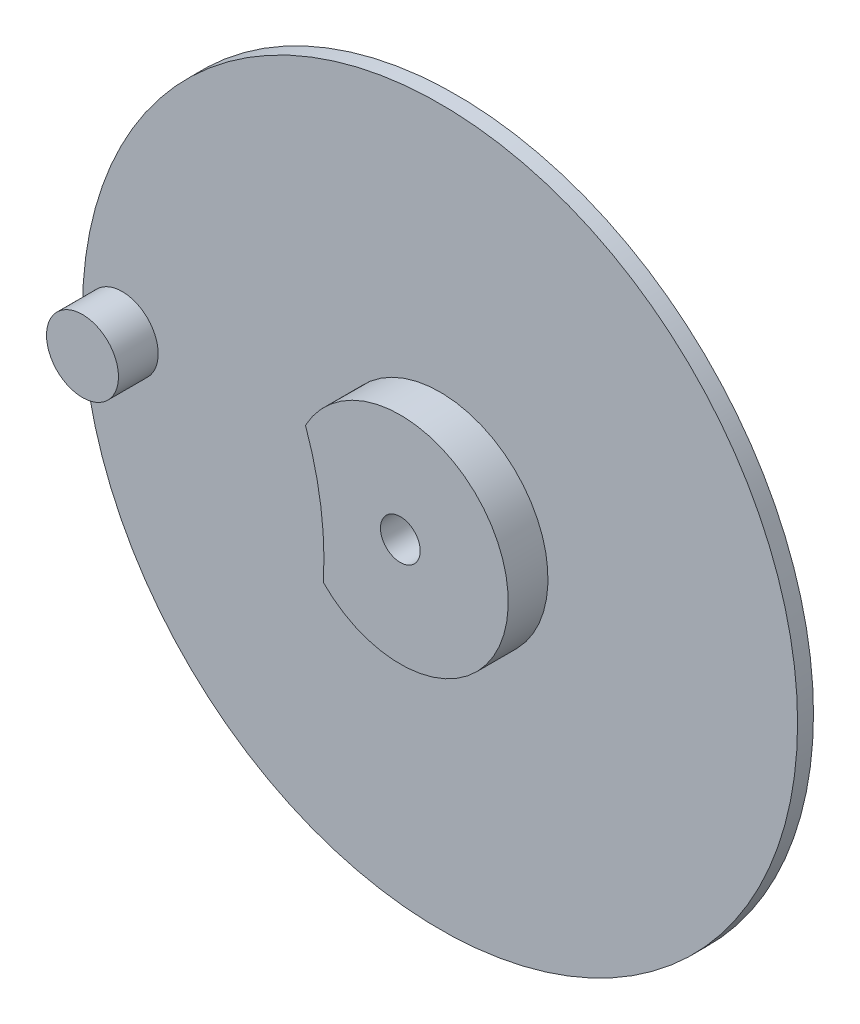
ISO-10303-21;
HEADER;
FILE_DESCRIPTION(('STEP AP214'),'2;1');
FILE_NAME('part.step','',(''),(''),'','','');
FILE_SCHEMA(('AUTOMOTIVE_DESIGN { 1 0 10303 214 1 1 1 1 }'));
ENDSEC;
DATA;
#1=APPLICATION_CONTEXT('core data for automotive mechanical design processes');
#2=APPLICATION_PROTOCOL_DEFINITION('international standard','automotive_design',2000,#1);
#3=PRODUCT_CONTEXT('',#1,'mechanical');
#4=PRODUCT('Part','Part','',(#3));
#5=PRODUCT_RELATED_PRODUCT_CATEGORY('part','',(#4));
#6=PRODUCT_DEFINITION_FORMATION('','',#4);
#7=PRODUCT_DEFINITION_CONTEXT('part definition',#1,'design');
#8=PRODUCT_DEFINITION('design','',#6,#7);
#9=PRODUCT_DEFINITION_SHAPE('','',#8);
#10=(LENGTH_UNIT() NAMED_UNIT(*) SI_UNIT(.MILLI.,.METRE.));
#11=(NAMED_UNIT(*) PLANE_ANGLE_UNIT() SI_UNIT($,.RADIAN.));
#12=(NAMED_UNIT(*) SI_UNIT($,.STERADIAN.) SOLID_ANGLE_UNIT());
#13=UNCERTAINTY_MEASURE_WITH_UNIT(LENGTH_MEASURE(1.E-05),#10,'distance_accuracy_value','');
#14=(GEOMETRIC_REPRESENTATION_CONTEXT(3) GLOBAL_UNCERTAINTY_ASSIGNED_CONTEXT((#13)) GLOBAL_UNIT_ASSIGNED_CONTEXT((#10,
#11,#12)) REPRESENTATION_CONTEXT('',''));
#15=CARTESIAN_POINT('',(0.,0.,0.));
#16=DIRECTION('',(0.,0.,1.));
#17=DIRECTION('',(1.,0.,0.));
#18=AXIS2_PLACEMENT_3D('',#15,#16,#17);
#19=CARTESIAN_POINT('',(1.30433178975156,-0.0378566474408444,-3.3207059005087));
#20=DIRECTION('',(0.,0.,1.));
#21=DIRECTION('',(1.,0.,0.));
#22=AXIS2_PLACEMENT_3D('',#19,#20,#21);
#23=CYLINDRICAL_SURFACE('',#22,4.96875);
#24=CARTESIAN_POINT('',(1.30433178975156,-0.0378566474408444,-3.3207059005087));
#25=DIRECTION('',(0.,0.,1.));
#26=DIRECTION('',(1.,0.,0.));
#27=AXIS2_PLACEMENT_3D('',#24,#25,#26);
#28=CIRCLE('',#27,4.96875);
#29=CARTESIAN_POINT('',(6.27308178975156,-0.0378566474408444,-3.3207059005087));
#30=VERTEX_POINT('',#29);
#31=EDGE_CURVE('E54',#30,#30,#28,.T.);
#32=CARTESIAN_POINT('',(1.30433178975156,-0.0378566474408444,10.5917940994913));
#33=DIRECTION('',(0.,0.,1.));
#34=DIRECTION('',(1.,0.,0.));
#35=AXIS2_PLACEMENT_3D('',#32,#33,#34);
#36=CIRCLE('',#35,4.96875);
#37=CARTESIAN_POINT('',(6.27308178975156,-0.0378566474408444,10.5917940994913));
#38=VERTEX_POINT('',#37);
#39=EDGE_CURVE('E81',#38,#38,#36,.T.);
#40=CARTESIAN_POINT('',(6.27308178975156,-0.0378566474408444,-3.3207059005087));
#41=CARTESIAN_POINT('',(6.27308178975156,-0.0378566474408444,-3.1757840255087));
#42=CARTESIAN_POINT('',(6.27308178975156,-0.0378566474408444,-3.0308621505087));
#43=CARTESIAN_POINT('',(6.27308178975156,-0.0378566474408444,-2.7410184005087));
#44=CARTESIAN_POINT('',(6.27308178975156,-0.0378566474408444,-2.5960965255087));
#45=CARTESIAN_POINT('',(6.27308178975156,-0.0378566474408444,-2.3062527755087));
#46=CARTESIAN_POINT('',(6.27308178975156,-0.0378566474408444,-2.1613309005087));
#47=CARTESIAN_POINT('',(6.27308178975156,-0.0378566474408444,-1.8714871505087));
#48=CARTESIAN_POINT('',(6.27308178975156,-0.0378566474408444,-1.7265652755087));
#49=CARTESIAN_POINT('',(6.27308178975156,-0.0378566474408444,-1.4367215255087));
#50=CARTESIAN_POINT('',(6.27308178975156,-0.0378566474408444,-1.2917996505087));
#51=CARTESIAN_POINT('',(6.27308178975156,-0.0378566474408444,-1.0019559005087));
#52=CARTESIAN_POINT('',(6.27308178975156,-0.0378566474408444,-0.857034025508697));
#53=CARTESIAN_POINT('',(6.27308178975156,-0.0378566474408444,-0.567190275508697));
#54=CARTESIAN_POINT('',(6.27308178975156,-0.0378566474408444,-0.422268400508697));
#55=CARTESIAN_POINT('',(6.27308178975156,-0.0378566474408444,-0.132424650508697));
#56=CARTESIAN_POINT('',(6.27308178975156,-0.0378566474408444,0.0124972244913031));
#57=CARTESIAN_POINT('',(6.27308178975156,-0.0378566474408444,0.302340974491303));
#58=CARTESIAN_POINT('',(6.27308178975156,-0.0378566474408444,0.447262849491303));
#59=CARTESIAN_POINT('',(6.27308178975156,-0.0378566474408444,0.737106599491303));
#60=CARTESIAN_POINT('',(6.27308178975156,-0.0378566474408444,0.882028474491303));
#61=CARTESIAN_POINT('',(6.27308178975156,-0.0378566474408444,1.1718722244913));
#62=CARTESIAN_POINT('',(6.27308178975156,-0.0378566474408444,1.3167940994913));
#63=CARTESIAN_POINT('',(6.27308178975156,-0.0378566474408444,1.6066378494913));
#64=CARTESIAN_POINT('',(6.27308178975156,-0.0378566474408444,1.7515597244913));
#65=CARTESIAN_POINT('',(6.27308178975156,-0.0378566474408444,2.0414034744913));
#66=CARTESIAN_POINT('',(6.27308178975156,-0.0378566474408444,2.1863253494913));
#67=CARTESIAN_POINT('',(6.27308178975156,-0.0378566474408444,2.4761690994913));
#68=CARTESIAN_POINT('',(6.27308178975156,-0.0378566474408444,2.6210909744913));
#69=CARTESIAN_POINT('',(6.27308178975156,-0.0378566474408444,2.9109347244913));
#70=CARTESIAN_POINT('',(6.27308178975156,-0.0378566474408444,3.0558565994913));
#71=CARTESIAN_POINT('',(6.27308178975156,-0.0378566474408444,3.3457003494913));
#72=CARTESIAN_POINT('',(6.27308178975156,-0.0378566474408444,3.4906222244913));
#73=CARTESIAN_POINT('',(6.27308178975156,-0.0378566474408444,3.7804659744913));
#74=CARTESIAN_POINT('',(6.27308178975156,-0.0378566474408444,3.9253878494913));
#75=CARTESIAN_POINT('',(6.27308178975156,-0.0378566474408444,4.2152315994913));
#76=CARTESIAN_POINT('',(6.27308178975156,-0.0378566474408444,4.3601534744913));
#77=CARTESIAN_POINT('',(6.27308178975156,-0.0378566474408444,4.6499972244913));
#78=CARTESIAN_POINT('',(6.27308178975156,-0.0378566474408444,4.7949190994913));
#79=CARTESIAN_POINT('',(6.27308178975156,-0.0378566474408444,5.0847628494913));
#80=CARTESIAN_POINT('',(6.27308178975156,-0.0378566474408444,5.2296847244913));
#81=CARTESIAN_POINT('',(6.27308178975156,-0.0378566474408444,5.5195284744913));
#82=CARTESIAN_POINT('',(6.27308178975156,-0.0378566474408444,5.6644503494913));
#83=CARTESIAN_POINT('',(6.27308178975156,-0.0378566474408444,5.9542940994913));
#84=CARTESIAN_POINT('',(6.27308178975156,-0.0378566474408444,6.0992159744913));
#85=CARTESIAN_POINT('',(6.27308178975156,-0.0378566474408444,6.3890597244913));
#86=CARTESIAN_POINT('',(6.27308178975156,-0.0378566474408444,6.5339815994913));
#87=CARTESIAN_POINT('',(6.27308178975156,-0.0378566474408444,6.8238253494913));
#88=CARTESIAN_POINT('',(6.27308178975156,-0.0378566474408444,6.9687472244913));
#89=CARTESIAN_POINT('',(6.27308178975156,-0.0378566474408444,7.2585909744913));
#90=CARTESIAN_POINT('',(6.27308178975156,-0.0378566474408444,7.4035128494913));
#91=CARTESIAN_POINT('',(6.27308178975156,-0.0378566474408444,7.6933565994913));
#92=CARTESIAN_POINT('',(6.27308178975156,-0.0378566474408444,7.8382784744913));
#93=CARTESIAN_POINT('',(6.27308178975156,-0.0378566474408444,8.1281222244913));
#94=CARTESIAN_POINT('',(6.27308178975156,-0.0378566474408444,8.2730440994913));
#95=CARTESIAN_POINT('',(6.27308178975156,-0.0378566474408444,8.5628878494913));
#96=CARTESIAN_POINT('',(6.27308178975156,-0.0378566474408444,8.7078097244913));
#97=CARTESIAN_POINT('',(6.27308178975156,-0.0378566474408444,8.9976534744913));
#98=CARTESIAN_POINT('',(6.27308178975156,-0.0378566474408444,9.1425753494913));
#99=CARTESIAN_POINT('',(6.27308178975156,-0.0378566474408444,9.4324190994913));
#100=CARTESIAN_POINT('',(6.27308178975156,-0.0378566474408444,9.5773409744913));
#101=CARTESIAN_POINT('',(6.27308178975156,-0.0378566474408444,9.8671847244913));
#102=CARTESIAN_POINT('',(6.27308178975156,-0.0378566474408444,10.0121065994913));
#103=CARTESIAN_POINT('',(6.27308178975156,-0.0378566474408444,10.3019503494913));
#104=CARTESIAN_POINT('',(6.27308178975156,-0.0378566474408444,10.4468722244913));
#105=CARTESIAN_POINT('',(6.27308178975156,-0.0378566474408444,10.5917940994913));
#106=B_SPLINE_CURVE_WITH_KNOTS('',3,(#40,#41,#42,#43,#44,#45,#46,#47,#48,#49,#50,#51,#52,#53,
#54,#55,#56,#57,#58,#59,#60,#61,#62,#63,#64,#65,#66,#67,#68,#69,#70,#71,#72,#73,#74,#75,#76,#77,
#78,#79,#80,#81,#82,#83,#84,#85,#86,#87,#88,#89,#90,#91,#92,#93,#94,#95,#96,#97,#98,#99,#100,
#101,#102,#103,#104,#105),.UNSPECIFIED.,.F.,.F.,(4,2,2,2,2,2,2,2,2,2,2,2,2,2,2,2,2,2,2,2,2,2,2,
2,2,2,2,2,2,2,2,2,4),(0.,0.434765625,0.86953125,1.304296875,1.7390625,2.173828125,2.60859375,
3.043359375,3.478125,3.912890625,4.34765625,4.782421875,5.2171875,5.651953125,6.08671875,
6.521484375,6.95625,7.391015625,7.82578125,8.260546875,8.6953125,9.130078125,9.56484375,
9.999609375,10.434375,10.869140625,11.30390625,11.738671875,12.1734375,12.608203125,13.04296875,
13.477734375,13.9125),.UNSPECIFIED.);
#107=EDGE_CURVE('BSEAM45',#30,#38,#106,.T.);
#108=ORIENTED_EDGE('',*,*,#31,.F.);
#109=ORIENTED_EDGE('',*,*,#39,.T.);
#110=ORIENTED_EDGE('',*,*,#107,.T.);
#111=ORIENTED_EDGE('',*,*,#107,.F.);
#112=EDGE_LOOP('',(#108,#110,#109,#111));
#113=FACE_BOUND('',#112,.T.);
#114=ADVANCED_FACE('F45',(#113),#23,.F.);
#115=CARTESIAN_POINT('',(1.30433178975156,-0.0378566474408444,-3.3207059005087));
#116=DIRECTION('',(0.,0.,1.));
#117=DIRECTION('',(1.,0.,0.));
#118=AXIS2_PLACEMENT_3D('',#115,#116,#117);
#119=CYLINDRICAL_SURFACE('',#118,89.4375);
#120=CARTESIAN_POINT('',(1.30433178975156,-0.0378566474408444,-3.3207059005087));
#121=DIRECTION('',(0.,0.,1.));
#122=DIRECTION('',(1.,0.,0.));
#123=AXIS2_PLACEMENT_3D('',#120,#121,#122);
#124=CIRCLE('',#123,89.4375);
#125=CARTESIAN_POINT('',(90.7418317897516,-0.0378566474408444,-3.3207059005087));
#126=VERTEX_POINT('',#125);
#127=EDGE_CURVE('E11',#126,#126,#124,.T.);
#128=CARTESIAN_POINT('',(1.30433178975156,-0.0378566474408444,0.654294099491304));
#129=DIRECTION('',(0.,0.,1.));
#130=DIRECTION('',(1.,0.,0.));
#131=AXIS2_PLACEMENT_3D('',#128,#129,#130);
#132=CIRCLE('',#131,89.4375);
#133=CARTESIAN_POINT('',(90.7418317897516,-0.0378566474408444,0.654294099491304));
#134=VERTEX_POINT('',#133);
#135=EDGE_CURVE('E48',#134,#134,#132,.T.);
#136=CARTESIAN_POINT('',(90.7418317897516,-0.0378566474408444,-3.3207059005087));
#137=CARTESIAN_POINT('',(90.7418317897516,-0.0378566474408444,-3.2792996505087));
#138=CARTESIAN_POINT('',(90.7418317897516,-0.0378566474408444,-3.2378934005087));
#139=CARTESIAN_POINT('',(90.7418317897516,-0.0378566474408444,-3.1550809005087));
#140=CARTESIAN_POINT('',(90.7418317897516,-0.0378566474408444,-3.1136746505087));
#141=CARTESIAN_POINT('',(90.7418317897516,-0.0378566474408444,-3.0308621505087));
#142=CARTESIAN_POINT('',(90.7418317897516,-0.0378566474408444,-2.9894559005087));
#143=CARTESIAN_POINT('',(90.7418317897516,-0.0378566474408444,-2.9066434005087));
#144=CARTESIAN_POINT('',(90.7418317897516,-0.0378566474408444,-2.8652371505087));
#145=CARTESIAN_POINT('',(90.7418317897516,-0.0378566474408444,-2.7824246505087));
#146=CARTESIAN_POINT('',(90.7418317897516,-0.0378566474408444,-2.7410184005087));
#147=CARTESIAN_POINT('',(90.7418317897516,-0.0378566474408444,-2.6582059005087));
#148=CARTESIAN_POINT('',(90.7418317897516,-0.0378566474408444,-2.6167996505087));
#149=CARTESIAN_POINT('',(90.7418317897516,-0.0378566474408444,-2.5339871505087));
#150=CARTESIAN_POINT('',(90.7418317897516,-0.0378566474408444,-2.4925809005087));
#151=CARTESIAN_POINT('',(90.7418317897516,-0.0378566474408444,-2.4097684005087));
#152=CARTESIAN_POINT('',(90.7418317897516,-0.0378566474408444,-2.3683621505087));
#153=CARTESIAN_POINT('',(90.7418317897516,-0.0378566474408444,-2.2855496505087));
#154=CARTESIAN_POINT('',(90.7418317897516,-0.0378566474408444,-2.2441434005087));
#155=CARTESIAN_POINT('',(90.7418317897516,-0.0378566474408444,-2.1613309005087));
#156=CARTESIAN_POINT('',(90.7418317897516,-0.0378566474408444,-2.1199246505087));
#157=CARTESIAN_POINT('',(90.7418317897516,-0.0378566474408444,-2.0371121505087));
#158=CARTESIAN_POINT('',(90.7418317897516,-0.0378566474408444,-1.9957059005087));
#159=CARTESIAN_POINT('',(90.7418317897516,-0.0378566474408444,-1.9128934005087));
#160=CARTESIAN_POINT('',(90.7418317897516,-0.0378566474408444,-1.8714871505087));
#161=CARTESIAN_POINT('',(90.7418317897516,-0.0378566474408444,-1.7886746505087));
#162=CARTESIAN_POINT('',(90.7418317897516,-0.0378566474408444,-1.7472684005087));
#163=CARTESIAN_POINT('',(90.7418317897516,-0.0378566474408444,-1.6644559005087));
#164=CARTESIAN_POINT('',(90.7418317897516,-0.0378566474408444,-1.6230496505087));
#165=CARTESIAN_POINT('',(90.7418317897516,-0.0378566474408444,-1.5402371505087));
#166=CARTESIAN_POINT('',(90.7418317897516,-0.0378566474408444,-1.4988309005087));
#167=CARTESIAN_POINT('',(90.7418317897516,-0.0378566474408444,-1.4160184005087));
#168=CARTESIAN_POINT('',(90.7418317897516,-0.0378566474408444,-1.3746121505087));
#169=CARTESIAN_POINT('',(90.7418317897516,-0.0378566474408444,-1.2917996505087));
#170=CARTESIAN_POINT('',(90.7418317897516,-0.0378566474408444,-1.2503934005087));
#171=CARTESIAN_POINT('',(90.7418317897516,-0.0378566474408444,-1.1675809005087));
#172=CARTESIAN_POINT('',(90.7418317897516,-0.0378566474408444,-1.1261746505087));
#173=CARTESIAN_POINT('',(90.7418317897516,-0.0378566474408444,-1.0433621505087));
#174=CARTESIAN_POINT('',(90.7418317897516,-0.0378566474408444,-1.0019559005087));
#175=CARTESIAN_POINT('',(90.7418317897516,-0.0378566474408444,-0.919143400508697));
#176=CARTESIAN_POINT('',(90.7418317897516,-0.0378566474408444,-0.877737150508697));
#177=CARTESIAN_POINT('',(90.7418317897516,-0.0378566474408444,-0.794924650508697));
#178=CARTESIAN_POINT('',(90.7418317897516,-0.0378566474408444,-0.753518400508697));
#179=CARTESIAN_POINT('',(90.7418317897516,-0.0378566474408444,-0.670705900508696));
#180=CARTESIAN_POINT('',(90.7418317897516,-0.0378566474408444,-0.629299650508697));
#181=CARTESIAN_POINT('',(90.7418317897516,-0.0378566474408444,-0.546487150508697));
#182=CARTESIAN_POINT('',(90.7418317897516,-0.0378566474408444,-0.505080900508697));
#183=CARTESIAN_POINT('',(90.7418317897516,-0.0378566474408444,-0.422268400508697));
#184=CARTESIAN_POINT('',(90.7418317897516,-0.0378566474408444,-0.380862150508697));
#185=CARTESIAN_POINT('',(90.7418317897516,-0.0378566474408444,-0.298049650508696));
#186=CARTESIAN_POINT('',(90.7418317897516,-0.0378566474408444,-0.256643400508696));
#187=CARTESIAN_POINT('',(90.7418317897516,-0.0378566474408444,-0.173830900508696));
#188=CARTESIAN_POINT('',(90.7418317897516,-0.0378566474408444,-0.132424650508696));
#189=CARTESIAN_POINT('',(90.7418317897516,-0.0378566474408444,-0.0496121505086965));
#190=CARTESIAN_POINT('',(90.7418317897516,-0.0378566474408444,-0.0082059005086964));
#191=CARTESIAN_POINT('',(90.7418317897516,-0.0378566474408444,0.0746065994913037));
#192=CARTESIAN_POINT('',(90.7418317897516,-0.0378566474408444,0.116012849491304));
#193=CARTESIAN_POINT('',(90.7418317897516,-0.0378566474408444,0.198825349491304));
#194=CARTESIAN_POINT('',(90.7418317897516,-0.0378566474408444,0.240231599491304));
#195=CARTESIAN_POINT('',(90.7418317897516,-0.0378566474408444,0.323044099491304));
#196=CARTESIAN_POINT('',(90.7418317897516,-0.0378566474408444,0.364450349491304));
#197=CARTESIAN_POINT('',(90.7418317897516,-0.0378566474408444,0.447262849491304));
#198=CARTESIAN_POINT('',(90.7418317897516,-0.0378566474408444,0.488669099491304));
#199=CARTESIAN_POINT('',(90.7418317897516,-0.0378566474408444,0.571481599491304));
#200=CARTESIAN_POINT('',(90.7418317897516,-0.0378566474408444,0.612887849491304));
#201=CARTESIAN_POINT('',(90.7418317897516,-0.0378566474408444,0.654294099491304));
#202=B_SPLINE_CURVE_WITH_KNOTS('',3,(#136,#137,#138,#139,#140,#141,#142,#143,#144,#145,#146,
#147,#148,#149,#150,#151,#152,#153,#154,#155,#156,#157,#158,#159,#160,#161,#162,#163,#164,#165,
#166,#167,#168,#169,#170,#171,#172,#173,#174,#175,#176,#177,#178,#179,#180,#181,#182,#183,#184,
#185,#186,#187,#188,#189,#190,#191,#192,#193,#194,#195,#196,#197,#198,#199,#200,#201),
.UNSPECIFIED.,.F.,.F.,(4,2,2,2,2,2,2,2,2,2,2,2,2,2,2,2,2,2,2,2,2,2,2,2,2,2,2,2,2,2,2,2,4),(0.,
0.12421875,0.2484375,0.37265625,0.496875,0.62109375,0.7453125,0.869531250000001,0.99375,
1.11796875,1.2421875,1.36640625,1.490625,1.61484375,1.7390625,1.86328125,1.9875,2.11171875,
2.2359375,2.36015625,2.484375,2.60859375,2.7328125,2.85703125,2.98125,3.10546875,3.2296875,
3.35390625,3.478125,3.60234375,3.7265625,3.85078125,3.975),.UNSPECIFIED.);
#203=EDGE_CURVE('BSEAM111',#126,#134,#202,.T.);
#204=ORIENTED_EDGE('',*,*,#127,.T.);
#205=ORIENTED_EDGE('',*,*,#135,.F.);
#206=ORIENTED_EDGE('',*,*,#203,.T.);
#207=ORIENTED_EDGE('',*,*,#203,.F.);
#208=EDGE_LOOP('',(#204,#206,#205,#207));
#209=FACE_BOUND('',#208,.T.);
#210=ADVANCED_FACE('F111',(#209),#119,.T.);
#211=CARTESIAN_POINT('',(1.30433178975156,-0.0378566474408444,-3.3207059005087));
#212=DIRECTION('',(0.,0.,1.));
#213=DIRECTION('',(1.,0.,0.));
#214=AXIS2_PLACEMENT_3D('',#211,#212,#213);
#215=PLANE('',#214);
#216=ORIENTED_EDGE('',*,*,#31,.T.);
#217=EDGE_LOOP('',(#216));
#218=FACE_BOUND('',#217,.T.);
#219=ORIENTED_EDGE('',*,*,#127,.F.);
#220=EDGE_LOOP('',(#219));
#221=FACE_BOUND('',#220,.T.);
#222=ADVANCED_FACE('F113',(#218,#221),#215,.F.);
#223=CARTESIAN_POINT('',(1.30433178975156,-0.0378566474408444,0.654294099491304));
#224=DIRECTION('',(0.,0.,1.));
#225=DIRECTION('',(1.,0.,0.));
#226=AXIS2_PLACEMENT_3D('',#223,#224,#225);
#227=PLANE('',#226);
#228=CARTESIAN_POINT('',(-78.1956682102485,-0.0378566474408444,0.654294099491304));
#229=DIRECTION('',(0.,0.,1.));
#230=DIRECTION('',(1.,0.,0.));
#231=AXIS2_PLACEMENT_3D('',#228,#229,#230);
#232=CIRCLE('',#231,9.);
#233=CARTESIAN_POINT('',(-87.1956682102484,-0.0378566474408444,0.654294099491304));
#234=VERTEX_POINT('',#233);
#235=EDGE_CURVE('E96',#234,#234,#232,.T.);
#236=ORIENTED_EDGE('',*,*,#235,.F.);
#237=EDGE_LOOP('',(#236));
#238=FACE_BOUND('',#237,.T.);
#239=CARTESIAN_POINT('',(-97.2949549830495,-13.8685480833011,0.654294099491304));
#240=DIRECTION('',(0.,0.,1.));
#241=DIRECTION('',(1.,0.,0.));
#242=AXIS2_PLACEMENT_3D('',#239,#240,#241);
#243=CIRCLE('',#242,79.5000000000002);
#244=CARTESIAN_POINT('',(-17.9580145441784,-18.9577407303769,0.654294099491304));
#245=VERTEX_POINT('',#244);
#246=CARTESIAN_POINT('',(-22.4200503297534,12.8522051463488,0.654294099491304));
#247=VERTEX_POINT('',#246);
#248=EDGE_CURVE('E61',#245,#247,#243,.T.);
#249=ORIENTED_EDGE('',*,*,#248,.T.);
#250=CARTESIAN_POINT('',(1.30433178975156,-0.0378566474408444,0.654294099491304));
#251=DIRECTION('',(0.,0.,1.));
#252=DIRECTION('',(1.,0.,0.));
#253=AXIS2_PLACEMENT_3D('',#250,#251,#252);
#254=CIRCLE('',#253,27.);
#255=EDGE_CURVE('E84',#245,#247,#254,.T.);
#256=ORIENTED_EDGE('',*,*,#255,.F.);
#257=EDGE_LOOP('',(#249,#256));
#258=FACE_BOUND('',#257,.T.);
#259=ORIENTED_EDGE('',*,*,#135,.T.);
#260=EDGE_LOOP('',(#259));
#261=FACE_BOUND('',#260,.T.);
#262=ADVANCED_FACE('F89',(#238,#258,#261),#227,.T.);
#263=CARTESIAN_POINT('',(-97.2949549830495,-13.8685480833011,10.5917940994913));
#264=DIRECTION('',(0.,0.,-1.));
#265=DIRECTION('',(-1.,0.,0.));
#266=AXIS2_PLACEMENT_3D('',#263,#264,#265);
#267=CYLINDRICAL_SURFACE('',#266,79.5000000000002);
#268=ORIENTED_EDGE('',*,*,#248,.F.);
#269=DIRECTION('',(0.,0.,-1.));
#270=VECTOR('',#269,1.);
#271=CARTESIAN_POINT('',(-17.9580145441784,-18.9577407303769,10.5917940994913));
#272=LINE('',#271,#270);
#273=CARTESIAN_POINT('',(-17.9580145441784,-18.9577407303769,10.5917940994913));
#274=VERTEX_POINT('',#273);
#275=EDGE_CURVE('E80',#274,#245,#272,.T.);
#276=ORIENTED_EDGE('',*,*,#275,.F.);
#277=CARTESIAN_POINT('',(-97.2949549830495,-13.8685480833011,10.5917940994913));
#278=DIRECTION('',(0.,0.,1.));
#279=DIRECTION('',(1.,0.,0.));
#280=AXIS2_PLACEMENT_3D('',#277,#278,#279);
#281=CIRCLE('',#280,79.5000000000002);
#282=CARTESIAN_POINT('',(-22.4200503297534,12.8522051463488,10.5917940994913));
#283=VERTEX_POINT('',#282);
#284=EDGE_CURVE('E77',#274,#283,#281,.T.);
#285=ORIENTED_EDGE('',*,*,#284,.T.);
#286=DIRECTION('',(0.,0.,-1.));
#287=VECTOR('',#286,1.);
#288=CARTESIAN_POINT('',(-22.4200503297534,12.8522051463488,10.5917940994913));
#289=LINE('',#288,#287);
#290=EDGE_CURVE('E74',#283,#247,#289,.T.);
#291=ORIENTED_EDGE('',*,*,#290,.T.);
#292=EDGE_LOOP('',(#268,#276,#285,#291));
#293=FACE_BOUND('',#292,.T.);
#294=ADVANCED_FACE('F76',(#293),#267,.F.);
#295=CARTESIAN_POINT('',(1.30433178975156,-0.0378566474408444,10.5917940994913));
#296=DIRECTION('',(0.,0.,-1.));
#297=DIRECTION('',(-1.,0.,0.));
#298=AXIS2_PLACEMENT_3D('',#295,#296,#297);
#299=CYLINDRICAL_SURFACE('',#298,27.);
#300=ORIENTED_EDGE('',*,*,#255,.T.);
#301=ORIENTED_EDGE('',*,*,#290,.F.);
#302=CARTESIAN_POINT('',(1.30433178975156,-0.0378566474408444,10.5917940994913));
#303=DIRECTION('',(0.,0.,1.));
#304=DIRECTION('',(1.,0.,0.));
#305=AXIS2_PLACEMENT_3D('',#302,#303,#304);
#306=CIRCLE('',#305,27.);
#307=EDGE_CURVE('E69',#274,#283,#306,.T.);
#308=ORIENTED_EDGE('',*,*,#307,.F.);
#309=ORIENTED_EDGE('',*,*,#275,.T.);
#310=EDGE_LOOP('',(#300,#301,#308,#309));
#311=FACE_BOUND('',#310,.T.);
#312=ADVANCED_FACE('F85',(#311),#299,.T.);
#313=CARTESIAN_POINT('',(1.30433178975156,-0.0378566474408444,10.5917940994913));
#314=DIRECTION('',(0.,0.,1.));
#315=DIRECTION('',(1.,0.,0.));
#316=AXIS2_PLACEMENT_3D('',#313,#314,#315);
#317=PLANE('',#316);
#318=ORIENTED_EDGE('',*,*,#284,.F.);
#319=ORIENTED_EDGE('',*,*,#307,.T.);
#320=EDGE_LOOP('',(#318,#319));
#321=FACE_BOUND('',#320,.T.);
#322=ORIENTED_EDGE('',*,*,#39,.F.);
#323=EDGE_LOOP('',(#322));
#324=FACE_BOUND('',#323,.T.);
#325=ADVANCED_FACE('F129',(#321,#324),#317,.T.);
#326=CARTESIAN_POINT('',(-78.1956682102485,-0.0378566474408444,10.5917940994913));
#327=DIRECTION('',(0.,0.,-1.));
#328=DIRECTION('',(-1.,0.,0.));
#329=AXIS2_PLACEMENT_3D('',#326,#327,#328);
#330=CYLINDRICAL_SURFACE('',#329,9.);
#331=CARTESIAN_POINT('',(-78.1956682102485,-0.0378566474408444,10.5917940994913));
#332=DIRECTION('',(0.,0.,1.));
#333=DIRECTION('',(1.,0.,0.));
#334=AXIS2_PLACEMENT_3D('',#331,#332,#333);
#335=CIRCLE('',#334,9.);
#336=CARTESIAN_POINT('',(-87.1956682102484,-0.0378566474408444,10.5917940994913));
#337=VERTEX_POINT('',#336);
#338=EDGE_CURVE('E92',#337,#337,#335,.T.);
#339=CARTESIAN_POINT('',(-87.1956682102484,-0.0378566474408444,10.5917940994913));
#340=CARTESIAN_POINT('',(-87.1956682102484,-0.0378566474408444,10.4882784744913));
#341=CARTESIAN_POINT('',(-87.1956682102484,-0.0378566474408444,10.3847628494913));
#342=CARTESIAN_POINT('',(-87.1956682102484,-0.0378566474408444,10.1777315994913));
#343=CARTESIAN_POINT('',(-87.1956682102484,-0.0378566474408444,10.0742159744913));
#344=CARTESIAN_POINT('',(-87.1956682102484,-0.0378566474408444,9.8671847244913));
#345=CARTESIAN_POINT('',(-87.1956682102484,-0.0378566474408444,9.7636690994913));
#346=CARTESIAN_POINT('',(-87.1956682102484,-0.0378566474408444,9.5566378494913));
#347=CARTESIAN_POINT('',(-87.1956682102484,-0.0378566474408444,9.4531222244913));
#348=CARTESIAN_POINT('',(-87.1956682102484,-0.0378566474408444,9.2460909744913));
#349=CARTESIAN_POINT('',(-87.1956682102484,-0.0378566474408444,9.1425753494913));
#350=CARTESIAN_POINT('',(-87.1956682102484,-0.0378566474408444,8.9355440994913));
#351=CARTESIAN_POINT('',(-87.1956682102484,-0.0378566474408444,8.8320284744913));
#352=CARTESIAN_POINT('',(-87.1956682102484,-0.0378566474408444,8.6249972244913));
#353=CARTESIAN_POINT('',(-87.1956682102484,-0.0378566474408444,8.5214815994913));
#354=CARTESIAN_POINT('',(-87.1956682102484,-0.0378566474408444,8.3144503494913));
#355=CARTESIAN_POINT('',(-87.1956682102484,-0.0378566474408444,8.2109347244913));
#356=CARTESIAN_POINT('',(-87.1956682102484,-0.0378566474408444,8.0039034744913));
#357=CARTESIAN_POINT('',(-87.1956682102484,-0.0378566474408444,7.9003878494913));
#358=CARTESIAN_POINT('',(-87.1956682102484,-0.0378566474408444,7.6933565994913));
#359=CARTESIAN_POINT('',(-87.1956682102484,-0.0378566474408444,7.5898409744913));
#360=CARTESIAN_POINT('',(-87.1956682102484,-0.0378566474408444,7.3828097244913));
#361=CARTESIAN_POINT('',(-87.1956682102484,-0.0378566474408444,7.2792940994913));
#362=CARTESIAN_POINT('',(-87.1956682102484,-0.0378566474408444,7.0722628494913));
#363=CARTESIAN_POINT('',(-87.1956682102484,-0.0378566474408444,6.9687472244913));
#364=CARTESIAN_POINT('',(-87.1956682102484,-0.0378566474408444,6.7617159744913));
#365=CARTESIAN_POINT('',(-87.1956682102484,-0.0378566474408444,6.6582003494913));
#366=CARTESIAN_POINT('',(-87.1956682102484,-0.0378566474408444,6.4511690994913));
#367=CARTESIAN_POINT('',(-87.1956682102484,-0.0378566474408444,6.3476534744913));
#368=CARTESIAN_POINT('',(-87.1956682102484,-0.0378566474408444,6.1406222244913));
#369=CARTESIAN_POINT('',(-87.1956682102484,-0.0378566474408444,6.0371065994913));
#370=CARTESIAN_POINT('',(-87.1956682102484,-0.0378566474408444,5.8300753494913));
#371=CARTESIAN_POINT('',(-87.1956682102484,-0.0378566474408444,5.7265597244913));
#372=CARTESIAN_POINT('',(-87.1956682102484,-0.0378566474408444,5.5195284744913));
#373=CARTESIAN_POINT('',(-87.1956682102484,-0.0378566474408444,5.4160128494913));
#374=CARTESIAN_POINT('',(-87.1956682102484,-0.0378566474408444,5.2089815994913));
#375=CARTESIAN_POINT('',(-87.1956682102484,-0.0378566474408444,5.1054659744913));
#376=CARTESIAN_POINT('',(-87.1956682102484,-0.0378566474408444,4.8984347244913));
#377=CARTESIAN_POINT('',(-87.1956682102484,-0.0378566474408444,4.7949190994913));
#378=CARTESIAN_POINT('',(-87.1956682102484,-0.0378566474408444,4.5878878494913));
#379=CARTESIAN_POINT('',(-87.1956682102484,-0.0378566474408444,4.4843722244913));
#380=CARTESIAN_POINT('',(-87.1956682102484,-0.0378566474408444,4.2773409744913));
#381=CARTESIAN_POINT('',(-87.1956682102484,-0.0378566474408444,4.1738253494913));
#382=CARTESIAN_POINT('',(-87.1956682102484,-0.0378566474408444,3.9667940994913));
#383=CARTESIAN_POINT('',(-87.1956682102484,-0.0378566474408444,3.8632784744913));
#384=CARTESIAN_POINT('',(-87.1956682102484,-0.0378566474408444,3.6562472244913));
#385=CARTESIAN_POINT('',(-87.1956682102484,-0.0378566474408444,3.5527315994913));
#386=CARTESIAN_POINT('',(-87.1956682102484,-0.0378566474408444,3.3457003494913));
#387=CARTESIAN_POINT('',(-87.1956682102484,-0.0378566474408444,3.2421847244913));
#388=CARTESIAN_POINT('',(-87.1956682102484,-0.0378566474408444,3.0351534744913));
#389=CARTESIAN_POINT('',(-87.1956682102484,-0.0378566474408444,2.9316378494913));
#390=CARTESIAN_POINT('',(-87.1956682102484,-0.0378566474408444,2.7246065994913));
#391=CARTESIAN_POINT('',(-87.1956682102484,-0.0378566474408444,2.6210909744913));
#392=CARTESIAN_POINT('',(-87.1956682102484,-0.0378566474408444,2.4140597244913));
#393=CARTESIAN_POINT('',(-87.1956682102484,-0.0378566474408444,2.3105440994913));
#394=CARTESIAN_POINT('',(-87.1956682102484,-0.0378566474408444,2.1035128494913));
#395=CARTESIAN_POINT('',(-87.1956682102484,-0.0378566474408444,1.9999972244913));
#396=CARTESIAN_POINT('',(-87.1956682102484,-0.0378566474408444,1.7929659744913));
#397=CARTESIAN_POINT('',(-87.1956682102484,-0.0378566474408444,1.6894503494913));
#398=CARTESIAN_POINT('',(-87.1956682102484,-0.0378566474408444,1.4824190994913));
#399=CARTESIAN_POINT('',(-87.1956682102484,-0.0378566474408444,1.3789034744913));
#400=CARTESIAN_POINT('',(-87.1956682102484,-0.0378566474408444,1.1718722244913));
#401=CARTESIAN_POINT('',(-87.1956682102484,-0.0378566474408444,1.0683565994913));
#402=CARTESIAN_POINT('',(-87.1956682102484,-0.0378566474408444,0.861325349491304));
#403=CARTESIAN_POINT('',(-87.1956682102484,-0.0378566474408444,0.757809724491304));
#404=CARTESIAN_POINT('',(-87.1956682102484,-0.0378566474408444,0.654294099491304));
#405=B_SPLINE_CURVE_WITH_KNOTS('',3,(#339,#340,#341,#342,#343,#344,#345,#346,#347,#348,#349,
#350,#351,#352,#353,#354,#355,#356,#357,#358,#359,#360,#361,#362,#363,#364,#365,#366,#367,#368,
#369,#370,#371,#372,#373,#374,#375,#376,#377,#378,#379,#380,#381,#382,#383,#384,#385,#386,#387,
#388,#389,#390,#391,#392,#393,#394,#395,#396,#397,#398,#399,#400,#401,#402,#403,#404),
.UNSPECIFIED.,.F.,.F.,(4,2,2,2,2,2,2,2,2,2,2,2,2,2,2,2,2,2,2,2,2,2,2,2,2,2,2,2,2,2,2,2,4),(0.,
0.310546875000001,0.621093750000001,0.931640625000001,1.2421875,1.552734375,1.86328125,
2.173828125,2.484375,2.794921875,3.10546875,3.416015625,3.7265625,4.037109375,4.34765625,
4.658203125,4.96875,5.279296875,5.58984375,5.900390625,6.2109375,6.521484375,6.83203125,
7.142578125,7.453125,7.763671875,8.07421875,8.384765625,8.6953125,9.005859375,9.31640625,
9.626953125,9.9375),.UNSPECIFIED.);
#406=EDGE_CURVE('BSEAM132',#337,#234,#405,.T.);
#407=ORIENTED_EDGE('',*,*,#338,.F.);
#408=ORIENTED_EDGE('',*,*,#235,.T.);
#409=ORIENTED_EDGE('',*,*,#406,.T.);
#410=ORIENTED_EDGE('',*,*,#406,.F.);
#411=EDGE_LOOP('',(#407,#409,#408,#410));
#412=FACE_BOUND('',#411,.T.);
#413=ADVANCED_FACE('F132',(#412),#330,.T.);
#414=CARTESIAN_POINT('',(1.30433178975156,-0.0378566474408444,10.5917940994913));
#415=DIRECTION('',(0.,0.,1.));
#416=DIRECTION('',(1.,0.,0.));
#417=AXIS2_PLACEMENT_3D('',#414,#415,#416);
#418=PLANE('',#417);
#419=ORIENTED_EDGE('',*,*,#338,.T.);
#420=EDGE_LOOP('',(#419));
#421=FACE_BOUND('',#420,.T.);
#422=ADVANCED_FACE('F135',(#421),#418,.T.);
#423=CLOSED_SHELL('',(#114,#210,#222,#262,#294,#312,#325,#413,#422));
#424=MANIFOLD_SOLID_BREP('B2',#423);
#425=ADVANCED_BREP_SHAPE_REPRESENTATION('',(#18,#424),#14);
#426=SHAPE_DEFINITION_REPRESENTATION(#9,#425);
ENDSEC;
END-ISO-10303-21;
